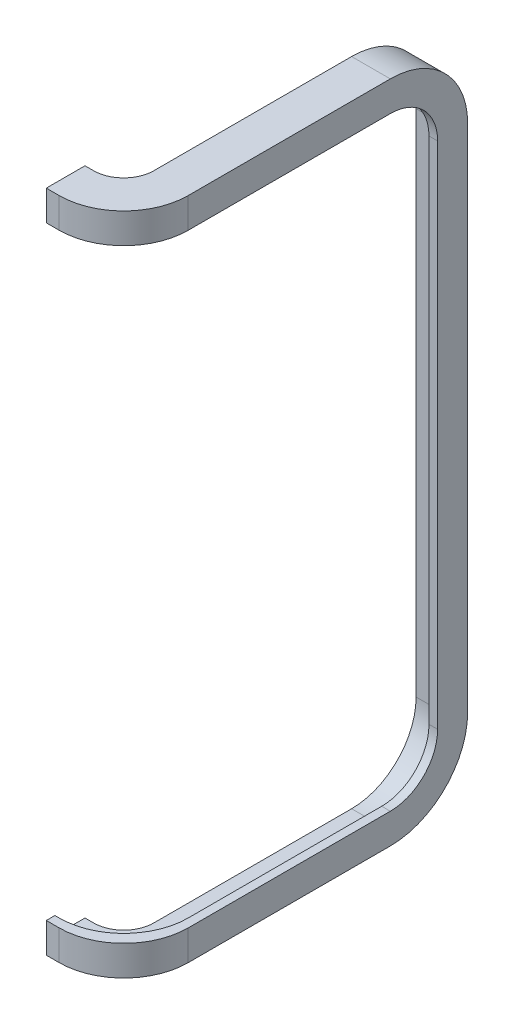
ISO-10303-21;
HEADER;
FILE_DESCRIPTION(('STEP AP214'),'2;1');
FILE_NAME('part.step','',(''),(''),'','','');
FILE_SCHEMA(('AUTOMOTIVE_DESIGN { 1 0 10303 214 1 1 1 1 }'));
ENDSEC;
DATA;
#1=APPLICATION_CONTEXT('core data for automotive mechanical design processes');
#2=APPLICATION_PROTOCOL_DEFINITION('international standard','automotive_design',2000,#1);
#3=PRODUCT_CONTEXT('',#1,'mechanical');
#4=PRODUCT('Part','Part','',(#3));
#5=PRODUCT_RELATED_PRODUCT_CATEGORY('part','',(#4));
#6=PRODUCT_DEFINITION_FORMATION('','',#4);
#7=PRODUCT_DEFINITION_CONTEXT('part definition',#1,'design');
#8=PRODUCT_DEFINITION('design','',#6,#7);
#9=PRODUCT_DEFINITION_SHAPE('','',#8);
#10=(LENGTH_UNIT() NAMED_UNIT(*) SI_UNIT(.MILLI.,.METRE.));
#11=(NAMED_UNIT(*) PLANE_ANGLE_UNIT() SI_UNIT($,.RADIAN.));
#12=(NAMED_UNIT(*) SI_UNIT($,.STERADIAN.) SOLID_ANGLE_UNIT());
#13=UNCERTAINTY_MEASURE_WITH_UNIT(LENGTH_MEASURE(1.E-05),#10,'distance_accuracy_value','');
#14=(GEOMETRIC_REPRESENTATION_CONTEXT(3) GLOBAL_UNCERTAINTY_ASSIGNED_CONTEXT((#13)) GLOBAL_UNIT_ASSIGNED_CONTEXT((#10,
#11,#12)) REPRESENTATION_CONTEXT('',''));
#15=CARTESIAN_POINT('',(0.,0.,0.));
#16=DIRECTION('',(0.,0.,1.));
#17=DIRECTION('',(1.,0.,0.));
#18=AXIS2_PLACEMENT_3D('',#15,#16,#17);
#19=CARTESIAN_POINT('',(112.5,-3.,0.));
#20=DIRECTION('',(0.,1.,0.));
#21=DIRECTION('',(0.,0.,1.));
#22=AXIS2_PLACEMENT_3D('',#19,#20,#21);
#23=PLANE('',#22);
#24=DIRECTION('',(0.,0.,-1.));
#25=VECTOR('',#24,1.);
#26=CARTESIAN_POINT('',(114.5,-3.,0.));
#27=LINE('',#26,#25);
#28=CARTESIAN_POINT('',(114.5,-3.,-13.));
#29=VERTEX_POINT('',#28);
#30=CARTESIAN_POINT('',(114.5,-3.,-60.));
#31=VERTEX_POINT('',#30);
#32=EDGE_CURVE('E339',#29,#31,#27,.T.);
#33=ORIENTED_EDGE('',*,*,#32,.F.);
#34=CARTESIAN_POINT('',(99.5,-3.,-13.));
#35=DIRECTION('',(0.,1.,0.));
#36=DIRECTION('',(0.,0.,1.));
#37=AXIS2_PLACEMENT_3D('',#34,#35,#36);
#38=CIRCLE('',#37,15.);
#39=CARTESIAN_POINT('',(99.5,-3.,2.00000000000001));
#40=VERTEX_POINT('',#39);
#41=EDGE_CURVE('E547',#29,#40,#38,.F.);
#42=ORIENTED_EDGE('',*,*,#41,.T.);
#43=DIRECTION('',(1.,0.,0.));
#44=VECTOR('',#43,1.);
#45=CARTESIAN_POINT('',(96.5,-3.,2.00000000000001));
#46=LINE('',#45,#44);
#47=CARTESIAN_POINT('',(96.5,-3.,2.00000000000001));
#48=VERTEX_POINT('',#47);
#49=EDGE_CURVE('E297',#48,#40,#46,.T.);
#50=ORIENTED_EDGE('',*,*,#49,.F.);
#51=DIRECTION('',(0.,0.,-1.));
#52=VECTOR('',#51,1.);
#53=CARTESIAN_POINT('',(96.5,-3.,-7.));
#54=LINE('',#53,#52);
#55=CARTESIAN_POINT('',(96.5,-3.,-7.));
#56=VERTEX_POINT('',#55);
#57=EDGE_CURVE('E326',#48,#56,#54,.T.);
#58=ORIENTED_EDGE('',*,*,#57,.T.);
#59=DIRECTION('',(1.,0.,0.));
#60=VECTOR('',#59,1.);
#61=CARTESIAN_POINT('',(96.5,-3.,-7.));
#62=LINE('',#61,#60);
#63=CARTESIAN_POINT('',(98.5,-3.,-7.));
#64=VERTEX_POINT('',#63);
#65=EDGE_CURVE('E331',#56,#64,#62,.T.);
#66=ORIENTED_EDGE('',*,*,#65,.T.);
#67=CARTESIAN_POINT('',(98.5,-3.,-14.));
#68=DIRECTION('',(0.,1.,0.));
#69=DIRECTION('',(0.,0.,1.));
#70=AXIS2_PLACEMENT_3D('',#67,#68,#69);
#71=CIRCLE('',#70,7.);
#72=CARTESIAN_POINT('',(105.5,-3.,-14.));
#73=VERTEX_POINT('',#72);
#74=EDGE_CURVE('E518',#64,#73,#71,.T.);
#75=ORIENTED_EDGE('',*,*,#74,.T.);
#76=DIRECTION('',(0.,0.,-1.));
#77=VECTOR('',#76,1.);
#78=CARTESIAN_POINT('',(105.5,-3.,0.));
#79=LINE('',#78,#77);
#80=CARTESIAN_POINT('',(105.5,-3.,-60.));
#81=VERTEX_POINT('',#80);
#82=EDGE_CURVE('E406',#73,#81,#79,.T.);
#83=ORIENTED_EDGE('',*,*,#82,.T.);
#84=DIRECTION('',(-1.,0.,0.));
#85=VECTOR('',#84,1.);
#86=CARTESIAN_POINT('',(112.5,-3.,-60.));
#87=LINE('',#86,#85);
#88=EDGE_CURVE('E491',#31,#81,#87,.T.);
#89=ORIENTED_EDGE('',*,*,#88,.F.);
#90=EDGE_LOOP('',(#33,#42,#50,#58,#66,#75,#83,#89));
#91=FACE_BOUND('',#90,.T.);
#92=ADVANCED_FACE('F39',(#91),#23,.F.);
#93=CARTESIAN_POINT('',(112.5,15.,-60.));
#94=DIRECTION('',(-1.,0.,0.));
#95=DIRECTION('',(0.,0.,1.));
#96=AXIS2_PLACEMENT_3D('',#93,#94,#95);
#97=CYLINDRICAL_SURFACE('',#96,18.);
#98=CARTESIAN_POINT('',(105.5,15.,-60.));
#99=DIRECTION('',(1.,0.,0.));
#100=DIRECTION('',(0.,0.,-1.));
#101=AXIS2_PLACEMENT_3D('',#98,#99,#100);
#102=CIRCLE('',#101,18.);
#103=CARTESIAN_POINT('',(105.5,15.,-78.));
#104=VERTEX_POINT('',#103);
#105=EDGE_CURVE('E430',#81,#104,#102,.T.);
#106=ORIENTED_EDGE('',*,*,#105,.T.);
#107=DIRECTION('',(-1.,0.,0.));
#108=VECTOR('',#107,1.);
#109=CARTESIAN_POINT('',(112.5,15.,-78.));
#110=LINE('',#109,#108);
#111=CARTESIAN_POINT('',(114.5,15.,-78.));
#112=VERTEX_POINT('',#111);
#113=EDGE_CURVE('E487',#112,#104,#110,.T.);
#114=ORIENTED_EDGE('',*,*,#113,.F.);
#115=CARTESIAN_POINT('',(114.5,15.,-60.));
#116=DIRECTION('',(1.,0.,0.));
#117=DIRECTION('',(0.,0.,-1.));
#118=AXIS2_PLACEMENT_3D('',#115,#116,#117);
#119=CIRCLE('',#118,18.);
#120=EDGE_CURVE('E342',#31,#112,#119,.T.);
#121=ORIENTED_EDGE('',*,*,#120,.F.);
#122=ORIENTED_EDGE('',*,*,#88,.T.);
#123=EDGE_LOOP('',(#106,#114,#121,#122));
#124=FACE_BOUND('',#123,.T.);
#125=ADVANCED_FACE('F659',(#124),#97,.T.);
#126=CARTESIAN_POINT('',(112.5,15.,-78.));
#127=DIRECTION('',(0.,0.,1.));
#128=DIRECTION('',(1.,0.,0.));
#129=AXIS2_PLACEMENT_3D('',#126,#127,#128);
#130=PLANE('',#129);
#131=DIRECTION('',(0.,1.,0.));
#132=VECTOR('',#131,1.);
#133=CARTESIAN_POINT('',(105.5,15.,-78.));
#134=LINE('',#133,#132);
#135=CARTESIAN_POINT('',(105.5,133.5,-78.));
#136=VERTEX_POINT('',#135);
#137=EDGE_CURVE('E433',#104,#136,#134,.T.);
#138=ORIENTED_EDGE('',*,*,#137,.T.);
#139=DIRECTION('',(-1.,0.,0.));
#140=VECTOR('',#139,1.);
#141=CARTESIAN_POINT('',(112.5,133.5,-78.));
#142=LINE('',#141,#140);
#143=CARTESIAN_POINT('',(114.5,133.5,-78.));
#144=VERTEX_POINT('',#143);
#145=EDGE_CURVE('E483',#144,#136,#142,.T.);
#146=ORIENTED_EDGE('',*,*,#145,.F.);
#147=DIRECTION('',(0.,1.,0.));
#148=VECTOR('',#147,1.);
#149=CARTESIAN_POINT('',(114.5,0.,-78.));
#150=LINE('',#149,#148);
#151=EDGE_CURVE('E347',#112,#144,#150,.T.);
#152=ORIENTED_EDGE('',*,*,#151,.F.);
#153=ORIENTED_EDGE('',*,*,#113,.T.);
#154=EDGE_LOOP('',(#138,#146,#152,#153));
#155=FACE_BOUND('',#154,.T.);
#156=ADVANCED_FACE('F661',(#155),#130,.F.);
#157=CARTESIAN_POINT('',(112.5,133.5,-60.));
#158=DIRECTION('',(-1.,0.,0.));
#159=DIRECTION('',(0.,0.,1.));
#160=AXIS2_PLACEMENT_3D('',#157,#158,#159);
#161=CYLINDRICAL_SURFACE('',#160,18.);
#162=CARTESIAN_POINT('',(105.5,133.5,-60.));
#163=DIRECTION('',(1.,0.,0.));
#164=DIRECTION('',(0.,0.,-1.));
#165=AXIS2_PLACEMENT_3D('',#162,#163,#164);
#166=CIRCLE('',#165,18.);
#167=CARTESIAN_POINT('',(105.5,151.5,-60.));
#168=VERTEX_POINT('',#167);
#169=EDGE_CURVE('E436',#136,#168,#166,.T.);
#170=ORIENTED_EDGE('',*,*,#169,.T.);
#171=DIRECTION('',(-1.,0.,0.));
#172=VECTOR('',#171,1.);
#173=CARTESIAN_POINT('',(112.5,151.5,-60.));
#174=LINE('',#173,#172);
#175=CARTESIAN_POINT('',(114.5,151.5,-60.));
#176=VERTEX_POINT('',#175);
#177=EDGE_CURVE('E479',#176,#168,#174,.T.);
#178=ORIENTED_EDGE('',*,*,#177,.F.);
#179=CARTESIAN_POINT('',(114.5,133.5,-60.));
#180=DIRECTION('',(1.,0.,0.));
#181=DIRECTION('',(0.,0.,-1.));
#182=AXIS2_PLACEMENT_3D('',#179,#180,#181);
#183=CIRCLE('',#182,18.);
#184=EDGE_CURVE('E351',#144,#176,#183,.T.);
#185=ORIENTED_EDGE('',*,*,#184,.F.);
#186=ORIENTED_EDGE('',*,*,#145,.T.);
#187=EDGE_LOOP('',(#170,#178,#185,#186));
#188=FACE_BOUND('',#187,.T.);
#189=ADVANCED_FACE('F576',(#188),#161,.T.);
#190=CARTESIAN_POINT('',(112.5,151.5,-60.));
#191=DIRECTION('',(0.,-1.,0.));
#192=DIRECTION('',(0.,0.,-1.));
#193=AXIS2_PLACEMENT_3D('',#190,#191,#192);
#194=PLANE('',#193);
#195=DIRECTION('',(1.,0.,0.));
#196=VECTOR('',#195,1.);
#197=CARTESIAN_POINT('',(96.5,151.5,2.00000000000002));
#198=LINE('',#197,#196);
#199=CARTESIAN_POINT('',(96.5,151.5,2.00000000000002));
#200=VERTEX_POINT('',#199);
#201=CARTESIAN_POINT('',(99.5,151.5,2.00000000000002));
#202=VERTEX_POINT('',#201);
#203=EDGE_CURVE('E242',#200,#202,#198,.T.);
#204=ORIENTED_EDGE('',*,*,#203,.T.);
#205=CARTESIAN_POINT('',(99.5,151.5,-13.));
#206=DIRECTION('',(0.,-1.,0.));
#207=DIRECTION('',(0.,0.,-1.));
#208=AXIS2_PLACEMENT_3D('',#205,#206,#207);
#209=CIRCLE('',#208,15.);
#210=CARTESIAN_POINT('',(114.5,151.5,-13.));
#211=VERTEX_POINT('',#210);
#212=EDGE_CURVE('E544',#202,#211,#209,.F.);
#213=ORIENTED_EDGE('',*,*,#212,.T.);
#214=DIRECTION('',(0.,0.,1.));
#215=VECTOR('',#214,1.);
#216=CARTESIAN_POINT('',(114.5,151.5,0.));
#217=LINE('',#216,#215);
#218=EDGE_CURVE('E355',#176,#211,#217,.T.);
#219=ORIENTED_EDGE('',*,*,#218,.F.);
#220=ORIENTED_EDGE('',*,*,#177,.T.);
#221=DIRECTION('',(0.,0.,1.));
#222=VECTOR('',#221,1.);
#223=CARTESIAN_POINT('',(105.5,151.5,-60.));
#224=LINE('',#223,#222);
#225=CARTESIAN_POINT('',(105.5,151.5,-14.));
#226=VERTEX_POINT('',#225);
#227=EDGE_CURVE('E439',#168,#226,#224,.T.);
#228=ORIENTED_EDGE('',*,*,#227,.T.);
#229=CARTESIAN_POINT('',(98.5,151.5,-14.));
#230=DIRECTION('',(0.,-1.,0.));
#231=DIRECTION('',(0.,0.,-1.));
#232=AXIS2_PLACEMENT_3D('',#229,#230,#231);
#233=CIRCLE('',#232,7.);
#234=CARTESIAN_POINT('',(98.5,151.5,-7.));
#235=VERTEX_POINT('',#234);
#236=EDGE_CURVE('E509',#226,#235,#233,.T.);
#237=ORIENTED_EDGE('',*,*,#236,.T.);
#238=DIRECTION('',(1.,0.,0.));
#239=VECTOR('',#238,1.);
#240=CARTESIAN_POINT('',(96.5,151.5,-7.));
#241=LINE('',#240,#239);
#242=CARTESIAN_POINT('',(96.5,151.5,-7.));
#243=VERTEX_POINT('',#242);
#244=EDGE_CURVE('E245',#243,#235,#241,.T.);
#245=ORIENTED_EDGE('',*,*,#244,.F.);
#246=DIRECTION('',(0.,0.,1.));
#247=VECTOR('',#246,1.);
#248=CARTESIAN_POINT('',(96.5,151.5,0.));
#249=LINE('',#248,#247);
#250=EDGE_CURVE('E239',#243,#200,#249,.T.);
#251=ORIENTED_EDGE('',*,*,#250,.T.);
#252=EDGE_LOOP('',(#204,#213,#219,#220,#228,#237,#245,#251));
#253=FACE_BOUND('',#252,.T.);
#254=ADVANCED_FACE('F241',(#253),#194,.F.);
#255=CARTESIAN_POINT('',(112.5,148.5,0.));
#256=DIRECTION('',(0.,1.,0.));
#257=DIRECTION('',(0.,0.,1.));
#258=AXIS2_PLACEMENT_3D('',#255,#256,#257);
#259=PLANE('',#258);
#260=DIRECTION('',(0.,0.,-1.));
#261=VECTOR('',#260,1.);
#262=CARTESIAN_POINT('',(112.5,148.5,0.));
#263=LINE('',#262,#261);
#264=CARTESIAN_POINT('',(112.5,148.5,-15.));
#265=VERTEX_POINT('',#264);
#266=CARTESIAN_POINT('',(112.5,148.5,-60.));
#267=VERTEX_POINT('',#266);
#268=EDGE_CURVE('E407',#265,#267,#263,.T.);
#269=ORIENTED_EDGE('',*,*,#268,.F.);
#270=CARTESIAN_POINT('',(97.5,148.5,-15.));
#271=DIRECTION('',(0.,1.,0.));
#272=DIRECTION('',(0.,0.,1.));
#273=AXIS2_PLACEMENT_3D('',#270,#271,#272);
#274=CIRCLE('',#273,15.);
#275=CARTESIAN_POINT('',(97.5,148.5,0.));
#276=VERTEX_POINT('',#275);
#277=EDGE_CURVE('E531',#265,#276,#274,.F.);
#278=ORIENTED_EDGE('',*,*,#277,.T.);
#279=DIRECTION('',(-1.,0.,0.));
#280=VECTOR('',#279,1.);
#281=CARTESIAN_POINT('',(112.5,148.5,0.));
#282=LINE('',#281,#280);
#283=CARTESIAN_POINT('',(96.5,148.5,0.));
#284=VERTEX_POINT('',#283);
#285=EDGE_CURVE('E476',#276,#284,#282,.T.);
#286=ORIENTED_EDGE('',*,*,#285,.T.);
#287=DIRECTION('',(0.,0.,-1.));
#288=VECTOR('',#287,1.);
#289=CARTESIAN_POINT('',(96.5,148.5,0.));
#290=LINE('',#289,#288);
#291=CARTESIAN_POINT('',(96.5,148.5,-7.));
#292=VERTEX_POINT('',#291);
#293=EDGE_CURVE('E301',#284,#292,#290,.T.);
#294=ORIENTED_EDGE('',*,*,#293,.T.);
#295=DIRECTION('',(1.,0.,0.));
#296=VECTOR('',#295,1.);
#297=CARTESIAN_POINT('',(96.5,148.5,-7.));
#298=LINE('',#297,#296);
#299=CARTESIAN_POINT('',(98.5,148.5,-7.));
#300=VERTEX_POINT('',#299);
#301=EDGE_CURVE('E251',#292,#300,#298,.T.);
#302=ORIENTED_EDGE('',*,*,#301,.T.);
#303=CARTESIAN_POINT('',(98.5,148.5,-14.));
#304=DIRECTION('',(0.,1.,0.));
#305=DIRECTION('',(0.,0.,1.));
#306=AXIS2_PLACEMENT_3D('',#303,#304,#305);
#307=CIRCLE('',#306,7.);
#308=CARTESIAN_POINT('',(105.5,148.5,-14.));
#309=VERTEX_POINT('',#308);
#310=EDGE_CURVE('E512',#300,#309,#307,.T.);
#311=ORIENTED_EDGE('',*,*,#310,.T.);
#312=DIRECTION('',(0.,0.,-1.));
#313=VECTOR('',#312,1.);
#314=CARTESIAN_POINT('',(105.5,148.5,0.));
#315=LINE('',#314,#313);
#316=CARTESIAN_POINT('',(105.5,148.5,-60.));
#317=VERTEX_POINT('',#316);
#318=EDGE_CURVE('E443',#309,#317,#315,.T.);
#319=ORIENTED_EDGE('',*,*,#318,.T.);
#320=DIRECTION('',(-1.,0.,0.));
#321=VECTOR('',#320,1.);
#322=CARTESIAN_POINT('',(112.5,148.5,-60.));
#323=LINE('',#322,#321);
#324=EDGE_CURVE('E472',#267,#317,#323,.T.);
#325=ORIENTED_EDGE('',*,*,#324,.F.);
#326=EDGE_LOOP('',(#269,#278,#286,#294,#302,#311,#319,#325));
#327=FACE_BOUND('',#326,.T.);
#328=ADVANCED_FACE('F593',(#327),#259,.F.);
#329=CARTESIAN_POINT('',(112.5,133.5,-60.));
#330=DIRECTION('',(-1.,0.,0.));
#331=DIRECTION('',(0.,0.,1.));
#332=AXIS2_PLACEMENT_3D('',#329,#330,#331);
#333=CYLINDRICAL_SURFACE('',#332,15.);
#334=CARTESIAN_POINT('',(105.5,133.5,-60.));
#335=DIRECTION('',(-1.,0.,0.));
#336=DIRECTION('',(0.,0.,-1.));
#337=AXIS2_PLACEMENT_3D('',#334,#335,#336);
#338=CIRCLE('',#337,15.);
#339=CARTESIAN_POINT('',(105.5,133.5,-75.));
#340=VERTEX_POINT('',#339);
#341=EDGE_CURVE('E446',#317,#340,#338,.T.);
#342=ORIENTED_EDGE('',*,*,#341,.T.);
#343=DIRECTION('',(-1.,0.,0.));
#344=VECTOR('',#343,1.);
#345=CARTESIAN_POINT('',(112.5,133.5,-75.));
#346=LINE('',#345,#344);
#347=CARTESIAN_POINT('',(112.5,133.5,-75.));
#348=VERTEX_POINT('',#347);
#349=EDGE_CURVE('E468',#348,#340,#346,.T.);
#350=ORIENTED_EDGE('',*,*,#349,.F.);
#351=CARTESIAN_POINT('',(112.5,133.5,-60.));
#352=DIRECTION('',(-1.,0.,0.));
#353=DIRECTION('',(0.,0.,-1.));
#354=AXIS2_PLACEMENT_3D('',#351,#352,#353);
#355=CIRCLE('',#354,15.);
#356=EDGE_CURVE('E410',#267,#348,#355,.T.);
#357=ORIENTED_EDGE('',*,*,#356,.F.);
#358=ORIENTED_EDGE('',*,*,#324,.T.);
#359=EDGE_LOOP('',(#342,#350,#357,#358));
#360=FACE_BOUND('',#359,.T.);
#361=ADVANCED_FACE('F799',(#360),#333,.F.);
#362=CARTESIAN_POINT('',(112.5,15.,-75.));
#363=DIRECTION('',(0.,0.,-1.));
#364=DIRECTION('',(0.,1.,0.));
#365=AXIS2_PLACEMENT_3D('',#362,#363,#364);
#366=PLANE('',#365);
#367=DIRECTION('',(0.,-1.,0.));
#368=VECTOR('',#367,1.);
#369=CARTESIAN_POINT('',(105.5,15.,-75.));
#370=LINE('',#369,#368);
#371=CARTESIAN_POINT('',(105.5,15.,-75.));
#372=VERTEX_POINT('',#371);
#373=EDGE_CURVE('E449',#340,#372,#370,.T.);
#374=ORIENTED_EDGE('',*,*,#373,.T.);
#375=DIRECTION('',(-1.,0.,0.));
#376=VECTOR('',#375,1.);
#377=CARTESIAN_POINT('',(112.5,15.,-75.));
#378=LINE('',#377,#376);
#379=CARTESIAN_POINT('',(112.5,15.,-75.));
#380=VERTEX_POINT('',#379);
#381=EDGE_CURVE('E464',#380,#372,#378,.T.);
#382=ORIENTED_EDGE('',*,*,#381,.F.);
#383=DIRECTION('',(0.,-1.,0.));
#384=VECTOR('',#383,1.);
#385=CARTESIAN_POINT('',(112.5,15.,-75.));
#386=LINE('',#385,#384);
#387=EDGE_CURVE('E415',#348,#380,#386,.T.);
#388=ORIENTED_EDGE('',*,*,#387,.F.);
#389=ORIENTED_EDGE('',*,*,#349,.T.);
#390=EDGE_LOOP('',(#374,#382,#388,#389));
#391=FACE_BOUND('',#390,.T.);
#392=ADVANCED_FACE('F887',(#391),#366,.F.);
#393=CARTESIAN_POINT('',(112.5,15.,-60.));
#394=DIRECTION('',(-1.,0.,0.));
#395=DIRECTION('',(0.,0.,1.));
#396=AXIS2_PLACEMENT_3D('',#393,#394,#395);
#397=CYLINDRICAL_SURFACE('',#396,15.);
#398=CARTESIAN_POINT('',(105.5,15.,-60.));
#399=DIRECTION('',(-1.,0.,0.));
#400=DIRECTION('',(0.,0.,-1.));
#401=AXIS2_PLACEMENT_3D('',#398,#399,#400);
#402=CIRCLE('',#401,15.);
#403=CARTESIAN_POINT('',(105.5,0.,-60.));
#404=VERTEX_POINT('',#403);
#405=EDGE_CURVE('E452',#372,#404,#402,.T.);
#406=ORIENTED_EDGE('',*,*,#405,.T.);
#407=DIRECTION('',(-1.,0.,0.));
#408=VECTOR('',#407,1.);
#409=CARTESIAN_POINT('',(112.5,0.,-60.));
#410=LINE('',#409,#408);
#411=CARTESIAN_POINT('',(112.5,0.,-60.));
#412=VERTEX_POINT('',#411);
#413=EDGE_CURVE('E460',#412,#404,#410,.T.);
#414=ORIENTED_EDGE('',*,*,#413,.F.);
#415=CARTESIAN_POINT('',(112.5,15.,-60.));
#416=DIRECTION('',(-1.,0.,0.));
#417=DIRECTION('',(0.,0.,-1.));
#418=AXIS2_PLACEMENT_3D('',#415,#416,#417);
#419=CIRCLE('',#418,15.);
#420=EDGE_CURVE('E419',#380,#412,#419,.T.);
#421=ORIENTED_EDGE('',*,*,#420,.F.);
#422=ORIENTED_EDGE('',*,*,#381,.T.);
#423=EDGE_LOOP('',(#406,#414,#421,#422));
#424=FACE_BOUND('',#423,.T.);
#425=ADVANCED_FACE('F788',(#424),#397,.F.);
#426=CARTESIAN_POINT('',(112.5,0.,0.));
#427=DIRECTION('',(0.,-1.,0.));
#428=DIRECTION('',(0.,0.,-1.));
#429=AXIS2_PLACEMENT_3D('',#426,#427,#428);
#430=PLANE('',#429);
#431=DIRECTION('',(-1.,0.,0.));
#432=VECTOR('',#431,1.);
#433=CARTESIAN_POINT('',(112.5,0.,0.));
#434=LINE('',#433,#432);
#435=CARTESIAN_POINT('',(97.5,0.,0.));
#436=VERTEX_POINT('',#435);
#437=CARTESIAN_POINT('',(96.5,0.,0.));
#438=VERTEX_POINT('',#437);
#439=EDGE_CURVE('E427',#436,#438,#434,.T.);
#440=ORIENTED_EDGE('',*,*,#439,.F.);
#441=CARTESIAN_POINT('',(97.5,0.,-15.));
#442=DIRECTION('',(0.,-1.,0.));
#443=DIRECTION('',(0.,0.,-1.));
#444=AXIS2_PLACEMENT_3D('',#441,#442,#443);
#445=CIRCLE('',#444,15.);
#446=CARTESIAN_POINT('',(112.5,0.,-15.));
#447=VERTEX_POINT('',#446);
#448=EDGE_CURVE('E63',#436,#447,#445,.F.);
#449=ORIENTED_EDGE('',*,*,#448,.T.);
#450=DIRECTION('',(0.,0.,1.));
#451=VECTOR('',#450,1.);
#452=CARTESIAN_POINT('',(112.5,0.,0.));
#453=LINE('',#452,#451);
#454=EDGE_CURVE('E423',#412,#447,#453,.T.);
#455=ORIENTED_EDGE('',*,*,#454,.F.);
#456=ORIENTED_EDGE('',*,*,#413,.T.);
#457=DIRECTION('',(0.,0.,1.));
#458=VECTOR('',#457,1.);
#459=CARTESIAN_POINT('',(105.5,0.,0.));
#460=LINE('',#459,#458);
#461=CARTESIAN_POINT('',(105.5,0.,-14.));
#462=VERTEX_POINT('',#461);
#463=EDGE_CURVE('E411',#404,#462,#460,.T.);
#464=ORIENTED_EDGE('',*,*,#463,.T.);
#465=CARTESIAN_POINT('',(98.5,0.,-14.));
#466=DIRECTION('',(0.,-1.,0.));
#467=DIRECTION('',(0.,0.,-1.));
#468=AXIS2_PLACEMENT_3D('',#465,#466,#467);
#469=CIRCLE('',#468,7.);
#470=CARTESIAN_POINT('',(98.5,0.,-7.));
#471=VERTEX_POINT('',#470);
#472=EDGE_CURVE('E515',#462,#471,#469,.T.);
#473=ORIENTED_EDGE('',*,*,#472,.T.);
#474=DIRECTION('',(1.,0.,0.));
#475=VECTOR('',#474,1.);
#476=CARTESIAN_POINT('',(96.5,0.,-7.));
#477=LINE('',#476,#475);
#478=CARTESIAN_POINT('',(96.5,0.,-7.));
#479=VERTEX_POINT('',#478);
#480=EDGE_CURVE('E330',#479,#471,#477,.T.);
#481=ORIENTED_EDGE('',*,*,#480,.F.);
#482=DIRECTION('',(0.,0.,1.));
#483=VECTOR('',#482,1.);
#484=CARTESIAN_POINT('',(96.5,0.,-7.));
#485=LINE('',#484,#483);
#486=EDGE_CURVE('E322',#479,#438,#485,.T.);
#487=ORIENTED_EDGE('',*,*,#486,.T.);
#488=EDGE_LOOP('',(#440,#449,#455,#456,#464,#473,#481,#487));
#489=FACE_BOUND('',#488,.T.);
#490=ADVANCED_FACE('F644',(#489),#430,.F.);
#491=CARTESIAN_POINT('',(105.5,15.,-60.));
#492=DIRECTION('',(1.,0.,0.));
#493=DIRECTION('',(0.,0.,-1.));
#494=AXIS2_PLACEMENT_3D('',#491,#492,#493);
#495=PLANE('',#494);
#496=ORIENTED_EDGE('',*,*,#318,.F.);
#497=DIRECTION('',(0.,1.,0.));
#498=VECTOR('',#497,1.);
#499=CARTESIAN_POINT('',(105.5,15.,-14.));
#500=LINE('',#499,#498);
#501=EDGE_CURVE('E499',#309,#226,#500,.T.);
#502=ORIENTED_EDGE('',*,*,#501,.T.);
#503=ORIENTED_EDGE('',*,*,#227,.F.);
#504=ORIENTED_EDGE('',*,*,#169,.F.);
#505=ORIENTED_EDGE('',*,*,#137,.F.);
#506=ORIENTED_EDGE('',*,*,#105,.F.);
#507=ORIENTED_EDGE('',*,*,#82,.F.);
#508=DIRECTION('',(0.,1.,0.));
#509=VECTOR('',#508,1.);
#510=CARTESIAN_POINT('',(105.5,15.,-14.));
#511=LINE('',#510,#509);
#512=EDGE_CURVE('E495',#73,#462,#511,.T.);
#513=ORIENTED_EDGE('',*,*,#512,.T.);
#514=ORIENTED_EDGE('',*,*,#463,.F.);
#515=ORIENTED_EDGE('',*,*,#405,.F.);
#516=ORIENTED_EDGE('',*,*,#373,.F.);
#517=ORIENTED_EDGE('',*,*,#341,.F.);
#518=EDGE_LOOP('',(#496,#502,#503,#504,#505,#506,#507,#513,#514,#515,#516,#517));
#519=FACE_BOUND('',#518,.T.);
#520=ADVANCED_FACE('F581',(#519),#495,.F.);
#521=CARTESIAN_POINT('',(112.5,0.,0.));
#522=DIRECTION('',(1.,0.,0.));
#523=DIRECTION('',(0.,0.,-1.));
#524=AXIS2_PLACEMENT_3D('',#521,#522,#523);
#525=PLANE('',#524);
#526=DIRECTION('',(0.,0.,-1.));
#527=VECTOR('',#526,1.);
#528=CARTESIAN_POINT('',(112.5,144.5,0.));
#529=LINE('',#528,#527);
#530=CARTESIAN_POINT('',(112.5,144.5,-15.));
#531=VERTEX_POINT('',#530);
#532=CARTESIAN_POINT('',(112.5,144.5,-60.));
#533=VERTEX_POINT('',#532);
#534=EDGE_CURVE('E335',#531,#533,#529,.T.);
#535=ORIENTED_EDGE('',*,*,#534,.F.);
#536=DIRECTION('',(0.,-1.,0.));
#537=VECTOR('',#536,1.);
#538=CARTESIAN_POINT('',(112.5,0.,-15.));
#539=LINE('',#538,#537);
#540=EDGE_CURVE('E528',#531,#265,#539,.F.);
#541=ORIENTED_EDGE('',*,*,#540,.T.);
#542=ORIENTED_EDGE('',*,*,#268,.T.);
#543=ORIENTED_EDGE('',*,*,#356,.T.);
#544=ORIENTED_EDGE('',*,*,#387,.T.);
#545=ORIENTED_EDGE('',*,*,#420,.T.);
#546=ORIENTED_EDGE('',*,*,#454,.T.);
#547=DIRECTION('',(0.,-1.,0.));
#548=VECTOR('',#547,1.);
#549=CARTESIAN_POINT('',(112.5,0.,-15.));
#550=LINE('',#549,#548);
#551=CARTESIAN_POINT('',(112.5,4.,-15.));
#552=VERTEX_POINT('',#551);
#553=EDGE_CURVE('E525',#447,#552,#550,.F.);
#554=ORIENTED_EDGE('',*,*,#553,.T.);
#555=DIRECTION('',(0.,0.,1.));
#556=VECTOR('',#555,1.);
#557=CARTESIAN_POINT('',(112.5,4.,0.));
#558=LINE('',#557,#556);
#559=CARTESIAN_POINT('',(112.5,4.,-60.));
#560=VERTEX_POINT('',#559);
#561=EDGE_CURVE('E343',#560,#552,#558,.T.);
#562=ORIENTED_EDGE('',*,*,#561,.F.);
#563=CARTESIAN_POINT('',(112.5,15.,-60.));
#564=DIRECTION('',(1.,0.,0.));
#565=DIRECTION('',(0.,0.,-1.));
#566=AXIS2_PLACEMENT_3D('',#563,#564,#565);
#567=CIRCLE('',#566,11.);
#568=CARTESIAN_POINT('',(112.5,15.,-71.));
#569=VERTEX_POINT('',#568);
#570=EDGE_CURVE('E388',#560,#569,#567,.T.);
#571=ORIENTED_EDGE('',*,*,#570,.T.);
#572=DIRECTION('',(0.,-1.,0.));
#573=VECTOR('',#572,1.);
#574=CARTESIAN_POINT('',(112.5,0.,-71.));
#575=LINE('',#574,#573);
#576=CARTESIAN_POINT('',(112.5,133.5,-71.));
#577=VERTEX_POINT('',#576);
#578=EDGE_CURVE('E384',#577,#569,#575,.T.);
#579=ORIENTED_EDGE('',*,*,#578,.F.);
#580=CARTESIAN_POINT('',(112.5,133.5,-60.));
#581=DIRECTION('',(1.,0.,0.));
#582=DIRECTION('',(0.,0.,-1.));
#583=AXIS2_PLACEMENT_3D('',#580,#581,#582);
#584=CIRCLE('',#583,11.);
#585=EDGE_CURVE('E380',#577,#533,#584,.T.);
#586=ORIENTED_EDGE('',*,*,#585,.T.);
#587=EDGE_LOOP('',(#535,#541,#542,#543,#544,#545,#546,#554,#562,#571,#579,#586));
#588=FACE_BOUND('',#587,.T.);
#589=ADVANCED_FACE('F604',(#588),#525,.F.);
#590=CARTESIAN_POINT('',(114.5,144.5,0.));
#591=DIRECTION('',(0.,1.,0.));
#592=DIRECTION('',(0.,0.,1.));
#593=AXIS2_PLACEMENT_3D('',#590,#591,#592);
#594=PLANE('',#593);
#595=DIRECTION('',(0.,0.,-1.));
#596=VECTOR('',#595,1.);
#597=CARTESIAN_POINT('',(114.5,144.5,0.));
#598=LINE('',#597,#596);
#599=CARTESIAN_POINT('',(114.5,144.5,-13.));
#600=VERTEX_POINT('',#599);
#601=CARTESIAN_POINT('',(114.5,144.5,-60.));
#602=VERTEX_POINT('',#601);
#603=EDGE_CURVE('E359',#600,#602,#598,.T.);
#604=ORIENTED_EDGE('',*,*,#603,.F.);
#605=CARTESIAN_POINT('',(99.5,144.5,-13.));
#606=DIRECTION('',(0.,1.,0.));
#607=DIRECTION('',(0.,0.,1.));
#608=AXIS2_PLACEMENT_3D('',#605,#606,#607);
#609=CIRCLE('',#608,15.);
#610=CARTESIAN_POINT('',(99.5,144.5,2.00000000000002));
#611=VERTEX_POINT('',#610);
#612=EDGE_CURVE('E48',#600,#611,#609,.F.);
#613=ORIENTED_EDGE('',*,*,#612,.T.);
#614=DIRECTION('',(1.,0.,0.));
#615=VECTOR('',#614,1.);
#616=CARTESIAN_POINT('',(96.5,144.5,2.00000000000002));
#617=LINE('',#616,#615);
#618=CARTESIAN_POINT('',(96.5,144.5,2.00000000000002));
#619=VERTEX_POINT('',#618);
#620=EDGE_CURVE('E263',#619,#611,#617,.T.);
#621=ORIENTED_EDGE('',*,*,#620,.F.);
#622=DIRECTION('',(0.,0.,-1.));
#623=VECTOR('',#622,1.);
#624=CARTESIAN_POINT('',(96.5,144.5,0.));
#625=LINE('',#624,#623);
#626=CARTESIAN_POINT('',(96.5,144.5,0.));
#627=VERTEX_POINT('',#626);
#628=EDGE_CURVE('E264',#619,#627,#625,.T.);
#629=ORIENTED_EDGE('',*,*,#628,.T.);
#630=DIRECTION('',(1.,0.,0.));
#631=VECTOR('',#630,1.);
#632=CARTESIAN_POINT('',(96.5,144.5,0.));
#633=LINE('',#632,#631);
#634=CARTESIAN_POINT('',(97.5,144.5,0.));
#635=VERTEX_POINT('',#634);
#636=EDGE_CURVE('E279',#627,#635,#633,.T.);
#637=ORIENTED_EDGE('',*,*,#636,.T.);
#638=CARTESIAN_POINT('',(97.5,144.5,-15.));
#639=DIRECTION('',(0.,1.,0.));
#640=DIRECTION('',(0.,0.,1.));
#641=AXIS2_PLACEMENT_3D('',#638,#639,#640);
#642=CIRCLE('',#641,15.);
#643=EDGE_CURVE('E558',#635,#531,#642,.T.);
#644=ORIENTED_EDGE('',*,*,#643,.T.);
#645=ORIENTED_EDGE('',*,*,#534,.T.);
#646=DIRECTION('',(-1.,0.,0.));
#647=VECTOR('',#646,1.);
#648=CARTESIAN_POINT('',(114.5,144.5,-60.));
#649=LINE('',#648,#647);
#650=EDGE_CURVE('E402',#602,#533,#649,.T.);
#651=ORIENTED_EDGE('',*,*,#650,.F.);
#652=EDGE_LOOP('',(#604,#613,#621,#629,#637,#644,#645,#651));
#653=FACE_BOUND('',#652,.T.);
#654=ADVANCED_FACE('F565',(#653),#594,.F.);
#655=CARTESIAN_POINT('',(114.5,133.5,-60.));
#656=DIRECTION('',(-1.,0.,0.));
#657=DIRECTION('',(0.,0.,1.));
#658=AXIS2_PLACEMENT_3D('',#655,#656,#657);
#659=CYLINDRICAL_SURFACE('',#658,11.);
#660=ORIENTED_EDGE('',*,*,#585,.F.);
#661=DIRECTION('',(-1.,0.,0.));
#662=VECTOR('',#661,1.);
#663=CARTESIAN_POINT('',(114.5,133.5,-71.));
#664=LINE('',#663,#662);
#665=CARTESIAN_POINT('',(114.5,133.5,-71.));
#666=VERTEX_POINT('',#665);
#667=EDGE_CURVE('E399',#666,#577,#664,.T.);
#668=ORIENTED_EDGE('',*,*,#667,.F.);
#669=CARTESIAN_POINT('',(114.5,133.5,-60.));
#670=DIRECTION('',(1.,0.,0.));
#671=DIRECTION('',(0.,0.,-1.));
#672=AXIS2_PLACEMENT_3D('',#669,#670,#671);
#673=CIRCLE('',#672,11.);
#674=EDGE_CURVE('E362',#666,#602,#673,.T.);
#675=ORIENTED_EDGE('',*,*,#674,.T.);
#676=ORIENTED_EDGE('',*,*,#650,.T.);
#677=EDGE_LOOP('',(#660,#668,#675,#676));
#678=FACE_BOUND('',#677,.T.);
#679=ADVANCED_FACE('F608',(#678),#659,.F.);
#680=CARTESIAN_POINT('',(114.5,0.,-71.));
#681=DIRECTION('',(0.,0.,-1.));
#682=DIRECTION('',(-1.,0.,0.));
#683=AXIS2_PLACEMENT_3D('',#680,#681,#682);
#684=PLANE('',#683);
#685=ORIENTED_EDGE('',*,*,#578,.T.);
#686=DIRECTION('',(-1.,0.,0.));
#687=VECTOR('',#686,1.);
#688=CARTESIAN_POINT('',(114.5,15.,-71.));
#689=LINE('',#688,#687);
#690=CARTESIAN_POINT('',(114.5,15.,-71.));
#691=VERTEX_POINT('',#690);
#692=EDGE_CURVE('E396',#691,#569,#689,.T.);
#693=ORIENTED_EDGE('',*,*,#692,.F.);
#694=DIRECTION('',(0.,-1.,0.));
#695=VECTOR('',#694,1.);
#696=CARTESIAN_POINT('',(114.5,0.,-71.));
#697=LINE('',#696,#695);
#698=EDGE_CURVE('E366',#666,#691,#697,.T.);
#699=ORIENTED_EDGE('',*,*,#698,.F.);
#700=ORIENTED_EDGE('',*,*,#667,.T.);
#701=EDGE_LOOP('',(#685,#693,#699,#700));
#702=FACE_BOUND('',#701,.T.);
#703=ADVANCED_FACE('F614',(#702),#684,.F.);
#704=CARTESIAN_POINT('',(114.5,15.,-60.));
#705=DIRECTION('',(-1.,0.,0.));
#706=DIRECTION('',(0.,0.,1.));
#707=AXIS2_PLACEMENT_3D('',#704,#705,#706);
#708=CYLINDRICAL_SURFACE('',#707,11.);
#709=ORIENTED_EDGE('',*,*,#570,.F.);
#710=DIRECTION('',(-1.,0.,0.));
#711=VECTOR('',#710,1.);
#712=CARTESIAN_POINT('',(114.5,4.,-60.));
#713=LINE('',#712,#711);
#714=CARTESIAN_POINT('',(114.5,4.,-60.));
#715=VERTEX_POINT('',#714);
#716=EDGE_CURVE('E377',#715,#560,#713,.T.);
#717=ORIENTED_EDGE('',*,*,#716,.F.);
#718=CARTESIAN_POINT('',(114.5,15.,-60.));
#719=DIRECTION('',(1.,0.,0.));
#720=DIRECTION('',(0.,0.,-1.));
#721=AXIS2_PLACEMENT_3D('',#718,#719,#720);
#722=CIRCLE('',#721,11.);
#723=EDGE_CURVE('E369',#715,#691,#722,.T.);
#724=ORIENTED_EDGE('',*,*,#723,.T.);
#725=ORIENTED_EDGE('',*,*,#692,.T.);
#726=EDGE_LOOP('',(#709,#717,#724,#725));
#727=FACE_BOUND('',#726,.T.);
#728=ADVANCED_FACE('F617',(#727),#708,.F.);
#729=CARTESIAN_POINT('',(114.5,4.,0.));
#730=DIRECTION('',(0.,-1.,0.));
#731=DIRECTION('',(0.,0.,-1.));
#732=AXIS2_PLACEMENT_3D('',#729,#730,#731);
#733=PLANE('',#732);
#734=DIRECTION('',(1.,0.,0.));
#735=VECTOR('',#734,1.);
#736=CARTESIAN_POINT('',(96.5,4.,2.));
#737=LINE('',#736,#735);
#738=CARTESIAN_POINT('',(96.5,4.,2.));
#739=VERTEX_POINT('',#738);
#740=CARTESIAN_POINT('',(99.5,4.,2.));
#741=VERTEX_POINT('',#740);
#742=EDGE_CURVE('E302',#739,#741,#737,.T.);
#743=ORIENTED_EDGE('',*,*,#742,.T.);
#744=CARTESIAN_POINT('',(99.5,4.,-13.));
#745=DIRECTION('',(0.,-1.,0.));
#746=DIRECTION('',(0.,0.,-1.));
#747=AXIS2_PLACEMENT_3D('',#744,#745,#746);
#748=CIRCLE('',#747,15.);
#749=CARTESIAN_POINT('',(114.5,4.,-13.));
#750=VERTEX_POINT('',#749);
#751=EDGE_CURVE('E11',#741,#750,#748,.F.);
#752=ORIENTED_EDGE('',*,*,#751,.T.);
#753=DIRECTION('',(0.,0.,1.));
#754=VECTOR('',#753,1.);
#755=CARTESIAN_POINT('',(114.5,4.,0.));
#756=LINE('',#755,#754);
#757=EDGE_CURVE('E373',#715,#750,#756,.T.);
#758=ORIENTED_EDGE('',*,*,#757,.F.);
#759=ORIENTED_EDGE('',*,*,#716,.T.);
#760=ORIENTED_EDGE('',*,*,#561,.T.);
#761=CARTESIAN_POINT('',(97.5,4.,-15.));
#762=DIRECTION('',(0.,-1.,0.));
#763=DIRECTION('',(0.,0.,-1.));
#764=AXIS2_PLACEMENT_3D('',#761,#762,#763);
#765=CIRCLE('',#764,15.);
#766=CARTESIAN_POINT('',(97.5,4.,0.));
#767=VERTEX_POINT('',#766);
#768=EDGE_CURVE('E55',#552,#767,#765,.T.);
#769=ORIENTED_EDGE('',*,*,#768,.T.);
#770=DIRECTION('',(1.,0.,0.));
#771=VECTOR('',#770,1.);
#772=CARTESIAN_POINT('',(96.5,4.,0.));
#773=LINE('',#772,#771);
#774=CARTESIAN_POINT('',(96.5,4.,0.));
#775=VERTEX_POINT('',#774);
#776=EDGE_CURVE('E296',#775,#767,#773,.T.);
#777=ORIENTED_EDGE('',*,*,#776,.F.);
#778=DIRECTION('',(0.,0.,1.));
#779=VECTOR('',#778,1.);
#780=CARTESIAN_POINT('',(96.5,4.,0.));
#781=LINE('',#780,#779);
#782=EDGE_CURVE('E288',#775,#739,#781,.T.);
#783=ORIENTED_EDGE('',*,*,#782,.T.);
#784=EDGE_LOOP('',(#743,#752,#758,#759,#760,#769,#777,#783));
#785=FACE_BOUND('',#784,.T.);
#786=ADVANCED_FACE('F620',(#785),#733,.F.);
#787=CARTESIAN_POINT('',(114.5,0.,0.));
#788=DIRECTION('',(1.,0.,0.));
#789=DIRECTION('',(0.,0.,-1.));
#790=AXIS2_PLACEMENT_3D('',#787,#788,#789);
#791=PLANE('',#790);
#792=ORIENTED_EDGE('',*,*,#218,.T.);
#793=DIRECTION('',(0.,-1.,0.));
#794=VECTOR('',#793,1.);
#795=CARTESIAN_POINT('',(114.5,0.,-13.));
#796=LINE('',#795,#794);
#797=EDGE_CURVE('E538',#211,#600,#796,.T.);
#798=ORIENTED_EDGE('',*,*,#797,.T.);
#799=ORIENTED_EDGE('',*,*,#603,.T.);
#800=ORIENTED_EDGE('',*,*,#674,.F.);
#801=ORIENTED_EDGE('',*,*,#698,.T.);
#802=ORIENTED_EDGE('',*,*,#723,.F.);
#803=ORIENTED_EDGE('',*,*,#757,.T.);
#804=DIRECTION('',(0.,-1.,0.));
#805=VECTOR('',#804,1.);
#806=CARTESIAN_POINT('',(114.5,0.,-13.));
#807=LINE('',#806,#805);
#808=EDGE_CURVE('E534',#750,#29,#807,.T.);
#809=ORIENTED_EDGE('',*,*,#808,.T.);
#810=ORIENTED_EDGE('',*,*,#32,.T.);
#811=ORIENTED_EDGE('',*,*,#120,.T.);
#812=ORIENTED_EDGE('',*,*,#151,.T.);
#813=ORIENTED_EDGE('',*,*,#184,.T.);
#814=EDGE_LOOP('',(#792,#798,#799,#800,#801,#802,#803,#809,#810,#811,#812,#813));
#815=FACE_BOUND('',#814,.T.);
#816=ADVANCED_FACE('F572',(#815),#791,.T.);
#817=CARTESIAN_POINT('',(96.5,-3.,-7.));
#818=DIRECTION('',(0.,0.,-1.));
#819=DIRECTION('',(-1.,0.,0.));
#820=AXIS2_PLACEMENT_3D('',#817,#818,#819);
#821=PLANE('',#820);
#822=ORIENTED_EDGE('',*,*,#480,.T.);
#823=DIRECTION('',(0.,1.,0.));
#824=VECTOR('',#823,1.);
#825=CARTESIAN_POINT('',(98.5,-3.,-7.));
#826=LINE('',#825,#824);
#827=EDGE_CURVE('E506',#471,#64,#826,.F.);
#828=ORIENTED_EDGE('',*,*,#827,.T.);
#829=ORIENTED_EDGE('',*,*,#65,.F.);
#830=DIRECTION('',(0.,1.,0.));
#831=VECTOR('',#830,1.);
#832=CARTESIAN_POINT('',(96.5,-3.,-7.));
#833=LINE('',#832,#831);
#834=EDGE_CURVE('E315',#56,#479,#833,.T.);
#835=ORIENTED_EDGE('',*,*,#834,.T.);
#836=EDGE_LOOP('',(#822,#828,#829,#835));
#837=FACE_BOUND('',#836,.T.);
#838=ADVANCED_FACE('F648',(#837),#821,.T.);
#839=CARTESIAN_POINT('',(96.5,0.,0.));
#840=DIRECTION('',(1.,0.,0.));
#841=DIRECTION('',(0.,0.,-1.));
#842=AXIS2_PLACEMENT_3D('',#839,#840,#841);
#843=PLANE('',#842);
#844=ORIENTED_EDGE('',*,*,#834,.F.);
#845=ORIENTED_EDGE('',*,*,#57,.F.);
#846=DIRECTION('',(0.,-1.,0.));
#847=VECTOR('',#846,1.);
#848=CARTESIAN_POINT('',(96.5,4.,2.));
#849=LINE('',#848,#847);
#850=EDGE_CURVE('E292',#739,#48,#849,.T.);
#851=ORIENTED_EDGE('',*,*,#850,.F.);
#852=ORIENTED_EDGE('',*,*,#782,.F.);
#853=DIRECTION('',(0.,1.,0.));
#854=VECTOR('',#853,1.);
#855=CARTESIAN_POINT('',(96.5,4.,0.));
#856=LINE('',#855,#854);
#857=EDGE_CURVE('E283',#438,#775,#856,.T.);
#858=ORIENTED_EDGE('',*,*,#857,.F.);
#859=ORIENTED_EDGE('',*,*,#486,.F.);
#860=EDGE_LOOP('',(#844,#845,#851,#852,#858,#859));
#861=FACE_BOUND('',#860,.T.);
#862=ADVANCED_FACE('F636',(#861),#843,.F.);
#863=CARTESIAN_POINT('',(96.5,151.5,-7.));
#864=DIRECTION('',(0.,0.,-1.));
#865=DIRECTION('',(-1.,0.,0.));
#866=AXIS2_PLACEMENT_3D('',#863,#864,#865);
#867=PLANE('',#866);
#868=ORIENTED_EDGE('',*,*,#244,.T.);
#869=DIRECTION('',(0.,1.,0.));
#870=VECTOR('',#869,1.);
#871=CARTESIAN_POINT('',(98.5,151.5,-7.));
#872=LINE('',#871,#870);
#873=EDGE_CURVE('E503',#235,#300,#872,.F.);
#874=ORIENTED_EDGE('',*,*,#873,.T.);
#875=ORIENTED_EDGE('',*,*,#301,.F.);
#876=DIRECTION('',(0.,1.,0.));
#877=VECTOR('',#876,1.);
#878=CARTESIAN_POINT('',(96.5,151.5,-7.));
#879=LINE('',#878,#877);
#880=EDGE_CURVE('E252',#292,#243,#879,.T.);
#881=ORIENTED_EDGE('',*,*,#880,.T.);
#882=EDGE_LOOP('',(#868,#874,#875,#881));
#883=FACE_BOUND('',#882,.T.);
#884=ADVANCED_FACE('F590',(#883),#867,.T.);
#885=CARTESIAN_POINT('',(96.5,0.,0.));
#886=DIRECTION('',(1.,0.,0.));
#887=DIRECTION('',(0.,0.,-1.));
#888=AXIS2_PLACEMENT_3D('',#885,#886,#887);
#889=PLANE('',#888);
#890=ORIENTED_EDGE('',*,*,#293,.F.);
#891=DIRECTION('',(0.,1.,0.));
#892=VECTOR('',#891,1.);
#893=CARTESIAN_POINT('',(96.5,151.5,0.));
#894=LINE('',#893,#892);
#895=EDGE_CURVE('E271',#627,#284,#894,.T.);
#896=ORIENTED_EDGE('',*,*,#895,.F.);
#897=ORIENTED_EDGE('',*,*,#628,.F.);
#898=DIRECTION('',(0.,-1.,0.));
#899=VECTOR('',#898,1.);
#900=CARTESIAN_POINT('',(96.5,151.5,2.00000000000002));
#901=LINE('',#900,#899);
#902=EDGE_CURVE('E258',#200,#619,#901,.T.);
#903=ORIENTED_EDGE('',*,*,#902,.F.);
#904=ORIENTED_EDGE('',*,*,#250,.F.);
#905=ORIENTED_EDGE('',*,*,#880,.F.);
#906=EDGE_LOOP('',(#890,#896,#897,#903,#904,#905));
#907=FACE_BOUND('',#906,.T.);
#908=ADVANCED_FACE('F267',(#907),#889,.F.);
#909=CARTESIAN_POINT('',(96.5,4.,0.));
#910=DIRECTION('',(0.,0.,-1.));
#911=DIRECTION('',(-1.,0.,0.));
#912=AXIS2_PLACEMENT_3D('',#909,#910,#911);
#913=PLANE('',#912);
#914=ORIENTED_EDGE('',*,*,#776,.T.);
#915=DIRECTION('',(0.,-1.,0.));
#916=VECTOR('',#915,1.);
#917=CARTESIAN_POINT('',(97.5,4.,0.));
#918=LINE('',#917,#916);
#919=EDGE_CURVE('E553',#767,#436,#918,.T.);
#920=ORIENTED_EDGE('',*,*,#919,.T.);
#921=ORIENTED_EDGE('',*,*,#439,.T.);
#922=ORIENTED_EDGE('',*,*,#857,.T.);
#923=EDGE_LOOP('',(#914,#920,#921,#922));
#924=FACE_BOUND('',#923,.T.);
#925=ADVANCED_FACE('F639',(#924),#913,.T.);
#926=CARTESIAN_POINT('',(96.5,4.,2.));
#927=DIRECTION('',(0.,0.,1.));
#928=DIRECTION('',(0.,-1.,0.));
#929=AXIS2_PLACEMENT_3D('',#926,#927,#928);
#930=PLANE('',#929);
#931=ORIENTED_EDGE('',*,*,#49,.T.);
#932=DIRECTION('',(0.,-1.,0.));
#933=VECTOR('',#932,1.);
#934=CARTESIAN_POINT('',(99.5,4.,2.));
#935=LINE('',#934,#933);
#936=EDGE_CURVE('E550',#40,#741,#935,.F.);
#937=ORIENTED_EDGE('',*,*,#936,.T.);
#938=ORIENTED_EDGE('',*,*,#742,.F.);
#939=ORIENTED_EDGE('',*,*,#850,.T.);
#940=EDGE_LOOP('',(#931,#937,#938,#939));
#941=FACE_BOUND('',#940,.T.);
#942=ADVANCED_FACE('F631',(#941),#930,.T.);
#943=CARTESIAN_POINT('',(96.5,151.5,0.));
#944=DIRECTION('',(0.,0.,-1.));
#945=DIRECTION('',(-1.,0.,0.));
#946=AXIS2_PLACEMENT_3D('',#943,#944,#945);
#947=PLANE('',#946);
#948=ORIENTED_EDGE('',*,*,#285,.F.);
#949=DIRECTION('',(0.,-1.,0.));
#950=VECTOR('',#949,1.);
#951=CARTESIAN_POINT('',(97.5,151.5,0.));
#952=LINE('',#951,#950);
#953=EDGE_CURVE('E521',#276,#635,#952,.T.);
#954=ORIENTED_EDGE('',*,*,#953,.T.);
#955=ORIENTED_EDGE('',*,*,#636,.F.);
#956=ORIENTED_EDGE('',*,*,#895,.T.);
#957=EDGE_LOOP('',(#948,#954,#955,#956));
#958=FACE_BOUND('',#957,.T.);
#959=ADVANCED_FACE('F598',(#958),#947,.T.);
#960=CARTESIAN_POINT('',(96.5,151.5,2.00000000000002));
#961=DIRECTION('',(0.,0.,1.));
#962=DIRECTION('',(0.,-1.,0.));
#963=AXIS2_PLACEMENT_3D('',#960,#961,#962);
#964=PLANE('',#963);
#965=ORIENTED_EDGE('',*,*,#620,.T.);
#966=DIRECTION('',(0.,-1.,0.));
#967=VECTOR('',#966,1.);
#968=CARTESIAN_POINT('',(99.5,151.5,2.00000000000002));
#969=LINE('',#968,#967);
#970=EDGE_CURVE('E261',#611,#202,#969,.F.);
#971=ORIENTED_EDGE('',*,*,#970,.T.);
#972=ORIENTED_EDGE('',*,*,#203,.F.);
#973=ORIENTED_EDGE('',*,*,#902,.T.);
#974=EDGE_LOOP('',(#965,#971,#972,#973));
#975=FACE_BOUND('',#974,.T.);
#976=ADVANCED_FACE('F257',(#975),#964,.T.);
#977=CARTESIAN_POINT('',(98.5,15.,-14.));
#978=DIRECTION('',(0.,1.,0.));
#979=DIRECTION('',(0.,0.,1.));
#980=AXIS2_PLACEMENT_3D('',#977,#978,#979);
#981=CYLINDRICAL_SURFACE('',#980,7.);
#982=ORIENTED_EDGE('',*,*,#310,.F.);
#983=ORIENTED_EDGE('',*,*,#873,.F.);
#984=ORIENTED_EDGE('',*,*,#236,.F.);
#985=ORIENTED_EDGE('',*,*,#501,.F.);
#986=EDGE_LOOP('',(#982,#983,#984,#985));
#987=FACE_BOUND('',#986,.T.);
#988=ADVANCED_FACE('F587',(#987),#981,.F.);
#989=CARTESIAN_POINT('',(98.5,15.,-14.));
#990=DIRECTION('',(0.,1.,0.));
#991=DIRECTION('',(0.,0.,1.));
#992=AXIS2_PLACEMENT_3D('',#989,#990,#991);
#993=CYLINDRICAL_SURFACE('',#992,7.);
#994=ORIENTED_EDGE('',*,*,#74,.F.);
#995=ORIENTED_EDGE('',*,*,#827,.F.);
#996=ORIENTED_EDGE('',*,*,#472,.F.);
#997=ORIENTED_EDGE('',*,*,#512,.F.);
#998=EDGE_LOOP('',(#994,#995,#996,#997));
#999=FACE_BOUND('',#998,.T.);
#1000=ADVANCED_FACE('F654',(#999),#993,.F.);
#1001=CARTESIAN_POINT('',(97.5,151.5,-15.));
#1002=DIRECTION('',(0.,-1.,0.));
#1003=DIRECTION('',(0.,0.,-1.));
#1004=AXIS2_PLACEMENT_3D('',#1001,#1002,#1003);
#1005=CYLINDRICAL_SURFACE('',#1004,15.);
#1006=ORIENTED_EDGE('',*,*,#277,.F.);
#1007=ORIENTED_EDGE('',*,*,#540,.F.);
#1008=ORIENTED_EDGE('',*,*,#643,.F.);
#1009=ORIENTED_EDGE('',*,*,#953,.F.);
#1010=EDGE_LOOP('',(#1006,#1007,#1008,#1009));
#1011=FACE_BOUND('',#1010,.T.);
#1012=ADVANCED_FACE('F600',(#1011),#1005,.F.);
#1013=CARTESIAN_POINT('',(99.5,0.,-13.));
#1014=DIRECTION('',(0.,-1.,0.));
#1015=DIRECTION('',(0.,0.,-1.));
#1016=AXIS2_PLACEMENT_3D('',#1013,#1014,#1015);
#1017=CYLINDRICAL_SURFACE('',#1016,15.);
#1018=ORIENTED_EDGE('',*,*,#212,.F.);
#1019=ORIENTED_EDGE('',*,*,#970,.F.);
#1020=ORIENTED_EDGE('',*,*,#612,.F.);
#1021=ORIENTED_EDGE('',*,*,#797,.F.);
#1022=EDGE_LOOP('',(#1018,#1019,#1020,#1021));
#1023=FACE_BOUND('',#1022,.T.);
#1024=ADVANCED_FACE('F569',(#1023),#1017,.T.);
#1025=CARTESIAN_POINT('',(99.5,0.,-13.));
#1026=DIRECTION('',(0.,-1.,0.));
#1027=DIRECTION('',(0.,0.,-1.));
#1028=AXIS2_PLACEMENT_3D('',#1025,#1026,#1027);
#1029=CYLINDRICAL_SURFACE('',#1028,15.);
#1030=ORIENTED_EDGE('',*,*,#751,.F.);
#1031=ORIENTED_EDGE('',*,*,#936,.F.);
#1032=ORIENTED_EDGE('',*,*,#41,.F.);
#1033=ORIENTED_EDGE('',*,*,#808,.F.);
#1034=EDGE_LOOP('',(#1030,#1031,#1032,#1033));
#1035=FACE_BOUND('',#1034,.T.);
#1036=ADVANCED_FACE('F625',(#1035),#1029,.T.);
#1037=CARTESIAN_POINT('',(97.5,4.,-15.));
#1038=DIRECTION('',(0.,-1.,0.));
#1039=DIRECTION('',(0.,0.,-1.));
#1040=AXIS2_PLACEMENT_3D('',#1037,#1038,#1039);
#1041=CYLINDRICAL_SURFACE('',#1040,15.);
#1042=ORIENTED_EDGE('',*,*,#768,.F.);
#1043=ORIENTED_EDGE('',*,*,#553,.F.);
#1044=ORIENTED_EDGE('',*,*,#448,.F.);
#1045=ORIENTED_EDGE('',*,*,#919,.F.);
#1046=EDGE_LOOP('',(#1042,#1043,#1044,#1045));
#1047=FACE_BOUND('',#1046,.T.);
#1048=ADVANCED_FACE('F41',(#1047),#1041,.F.);
#1049=CLOSED_SHELL('',(#92,#125,#156,#189,#254,#328,#361,#392,#425,#490,#520,#589,#654,#679,
#703,#728,#786,#816,#838,#862,#884,#908,#925,#942,#959,#976,#988,#1000,#1012,#1024,#1036,#1048));
#1050=MANIFOLD_SOLID_BREP('B2',#1049);
#1051=ADVANCED_BREP_SHAPE_REPRESENTATION('',(#18,#1050),#14);
#1052=SHAPE_DEFINITION_REPRESENTATION(#9,#1051);
ENDSEC;
END-ISO-10303-21;
